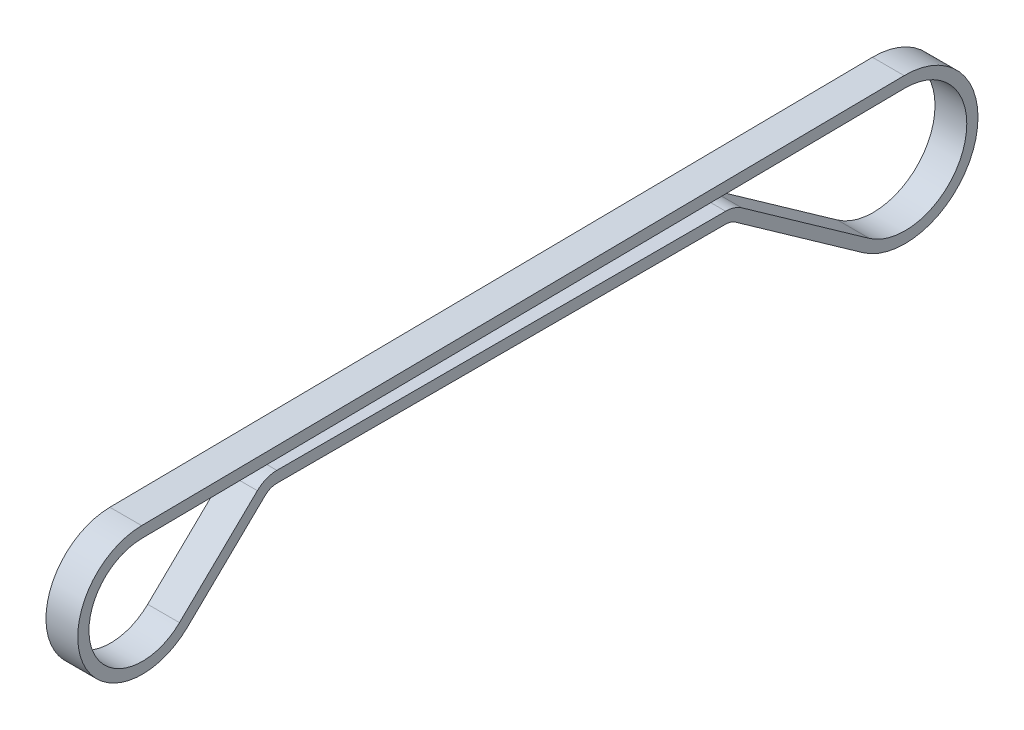
ISO-10303-21;
HEADER;
FILE_DESCRIPTION(('STEP AP214'),'2;1');
FILE_NAME('part.step','',(''),(''),'','','');
FILE_SCHEMA(('AUTOMOTIVE_DESIGN { 1 0 10303 214 1 1 1 1 }'));
ENDSEC;
DATA;
#1=APPLICATION_CONTEXT('core data for automotive mechanical design processes');
#2=APPLICATION_PROTOCOL_DEFINITION('international standard','automotive_design',2000,#1);
#3=PRODUCT_CONTEXT('',#1,'mechanical');
#4=PRODUCT('Part','Part','',(#3));
#5=PRODUCT_RELATED_PRODUCT_CATEGORY('part','',(#4));
#6=PRODUCT_DEFINITION_FORMATION('','',#4);
#7=PRODUCT_DEFINITION_CONTEXT('part definition',#1,'design');
#8=PRODUCT_DEFINITION('design','',#6,#7);
#9=PRODUCT_DEFINITION_SHAPE('','',#8);
#10=(LENGTH_UNIT() NAMED_UNIT(*) SI_UNIT(.MILLI.,.METRE.));
#11=(NAMED_UNIT(*) PLANE_ANGLE_UNIT() SI_UNIT($,.RADIAN.));
#12=(NAMED_UNIT(*) SI_UNIT($,.STERADIAN.) SOLID_ANGLE_UNIT());
#13=UNCERTAINTY_MEASURE_WITH_UNIT(LENGTH_MEASURE(1.E-05),#10,'distance_accuracy_value','');
#14=(GEOMETRIC_REPRESENTATION_CONTEXT(3) GLOBAL_UNCERTAINTY_ASSIGNED_CONTEXT((#13)) GLOBAL_UNIT_ASSIGNED_CONTEXT((#10,
#11,#12)) REPRESENTATION_CONTEXT('',''));
#15=CARTESIAN_POINT('',(0.,0.,0.));
#16=DIRECTION('',(0.,0.,1.));
#17=DIRECTION('',(1.,0.,0.));
#18=AXIS2_PLACEMENT_3D('',#15,#16,#17);
#19=CARTESIAN_POINT('',(15.7818,9.52499999999999,-216.033540427124));
#20=DIRECTION('',(0.,-1.,0.));
#21=DIRECTION('',(0.,0.,-1.));
#22=AXIS2_PLACEMENT_3D('',#19,#20,#21);
#23=PLANE('',#22);
#24=DIRECTION('',(0.,0.,1.));
#25=VECTOR('',#24,1.);
#26=CARTESIAN_POINT('',(6.78180000000002,9.52499999999999,-216.033540427124));
#27=LINE('',#26,#25);
#28=CARTESIAN_POINT('',(6.78180000000002,9.52499999999999,-165.233540427124));
#29=VERTEX_POINT('',#28);
#30=CARTESIAN_POINT('',(6.78180000000002,9.525,-38.1));
#31=VERTEX_POINT('',#30);
#32=EDGE_CURVE('E206',#29,#31,#27,.T.);
#33=ORIENTED_EDGE('',*,*,#32,.F.);
#34=DIRECTION('',(-1.,0.,0.));
#35=VECTOR('',#34,1.);
#36=CARTESIAN_POINT('',(15.7818,9.52499999999999,-165.233540427124));
#37=LINE('',#36,#35);
#38=CARTESIAN_POINT('',(15.7818,9.52499999999999,-165.233540427124));
#39=VERTEX_POINT('',#38);
#40=EDGE_CURVE('E11',#39,#29,#37,.T.);
#41=ORIENTED_EDGE('',*,*,#40,.F.);
#42=DIRECTION('',(0.,0.,1.));
#43=VECTOR('',#42,1.);
#44=CARTESIAN_POINT('',(15.7818,9.52499999999999,-216.033540427124));
#45=LINE('',#44,#43);
#46=CARTESIAN_POINT('',(15.7818,9.525,-38.1));
#47=VERTEX_POINT('',#46);
#48=EDGE_CURVE('E218',#39,#47,#45,.T.);
#49=ORIENTED_EDGE('',*,*,#48,.T.);
#50=DIRECTION('',(-1.,0.,0.));
#51=VECTOR('',#50,1.);
#52=CARTESIAN_POINT('',(15.7818,9.525,-38.1));
#53=LINE('',#52,#51);
#54=EDGE_CURVE('E40',#47,#31,#53,.T.);
#55=ORIENTED_EDGE('',*,*,#54,.T.);
#56=EDGE_LOOP('',(#33,#41,#49,#55));
#57=FACE_BOUND('',#56,.T.);
#58=ADVANCED_FACE('F37',(#57),#23,.T.);
#59=CARTESIAN_POINT('',(15.7818,4.7625,-165.233540427124));
#60=DIRECTION('',(-1.,0.,0.));
#61=DIRECTION('',(0.,0.,1.));
#62=AXIS2_PLACEMENT_3D('',#59,#60,#61);
#63=CYLINDRICAL_SURFACE('',#62,4.76249999999999);
#64=CARTESIAN_POINT('',(6.78180000000002,4.7625,-165.233540427124));
#65=DIRECTION('',(1.,0.,0.));
#66=DIRECTION('',(0.,0.,-1.));
#67=AXIS2_PLACEMENT_3D('',#64,#65,#66);
#68=CIRCLE('',#67,4.76249999999999);
#69=CARTESIAN_POINT('',(6.78180000000002,8.65054709624502,-167.983903317249));
#70=VERTEX_POINT('',#69);
#71=EDGE_CURVE('E222',#70,#29,#68,.T.);
#72=ORIENTED_EDGE('',*,*,#71,.F.);
#73=DIRECTION('',(-1.,0.,0.));
#74=VECTOR('',#73,1.);
#75=CARTESIAN_POINT('',(15.7818,8.65054709624502,-167.983903317249));
#76=LINE('',#75,#74);
#77=CARTESIAN_POINT('',(15.7818,8.65054709624502,-167.983903317249));
#78=VERTEX_POINT('',#77);
#79=EDGE_CURVE('E45',#78,#70,#76,.T.);
#80=ORIENTED_EDGE('',*,*,#79,.F.);
#81=CARTESIAN_POINT('',(15.7818,4.7625,-165.233540427124));
#82=DIRECTION('',(1.,0.,0.));
#83=DIRECTION('',(0.,0.,-1.));
#84=AXIS2_PLACEMENT_3D('',#81,#82,#83);
#85=CIRCLE('',#84,4.76249999999999);
#86=EDGE_CURVE('E238',#78,#39,#85,.T.);
#87=ORIENTED_EDGE('',*,*,#86,.T.);
#88=ORIENTED_EDGE('',*,*,#40,.T.);
#89=EDGE_LOOP('',(#72,#80,#87,#88));
#90=FACE_BOUND('',#89,.T.);
#91=ADVANCED_FACE('F286',(#90),#63,.F.);
#92=CARTESIAN_POINT('',(15.7818,-16.8883353140081,-204.086912833927));
#93=DIRECTION('',(0.,-0.816387841731233,0.577504018924041));
#94=DIRECTION('',(0.,-0.577504018924041,-0.816387841731233));
#95=AXIS2_PLACEMENT_3D('',#92,#93,#94);
#96=PLANE('',#95);
#97=DIRECTION('',(0.,0.577504018924041,0.816387841731233));
#98=VECTOR('',#97,1.);
#99=CARTESIAN_POINT('',(6.78180000000002,-16.8883353140081,-204.086912833927));
#100=LINE('',#99,#98);
#101=CARTESIAN_POINT('',(6.78180000000002,-16.8883353140081,-204.086912833927));
#102=VERTEX_POINT('',#101);
#103=EDGE_CURVE('E258',#102,#70,#100,.T.);
#104=ORIENTED_EDGE('',*,*,#103,.F.);
#105=DIRECTION('',(-1.,0.,0.));
#106=VECTOR('',#105,1.);
#107=CARTESIAN_POINT('',(15.7818,-16.8883353140081,-204.086912833927));
#108=LINE('',#107,#106);
#109=CARTESIAN_POINT('',(15.7818,-16.8883353140081,-204.086912833927));
#110=VERTEX_POINT('',#109);
#111=EDGE_CURVE('E264',#110,#102,#108,.T.);
#112=ORIENTED_EDGE('',*,*,#111,.F.);
#113=DIRECTION('',(0.,0.577504018924041,0.816387841731233));
#114=VECTOR('',#113,1.);
#115=CARTESIAN_POINT('',(15.7818,-16.8883353140081,-204.086912833927));
#116=LINE('',#115,#114);
#117=EDGE_CURVE('E235',#110,#78,#116,.T.);
#118=ORIENTED_EDGE('',*,*,#117,.T.);
#119=ORIENTED_EDGE('',*,*,#79,.T.);
#120=EDGE_LOOP('',(#104,#112,#118,#119));
#121=FACE_BOUND('',#120,.T.);
#122=ADVANCED_FACE('F305',(#121),#96,.T.);
#123=CARTESIAN_POINT('',(15.7818,0.,-216.033540427124));
#124=DIRECTION('',(-1.,0.,0.));
#125=DIRECTION('',(0.,0.,1.));
#126=AXIS2_PLACEMENT_3D('',#123,#124,#125);
#127=CYLINDRICAL_SURFACE('',#126,20.6866570650963);
#128=CARTESIAN_POINT('',(6.78180000000002,0.,-216.033540427124));
#129=DIRECTION('',(1.,0.,0.));
#130=DIRECTION('',(0.,0.,-1.));
#131=AXIS2_PLACEMENT_3D('',#128,#129,#130);
#132=CIRCLE('',#131,20.6866570650963);
#133=CARTESIAN_POINT('',(6.78180000000002,20.6853938432149,-215.804931415962));
#134=VERTEX_POINT('',#133);
#135=EDGE_CURVE('E255',#102,#134,#132,.T.);
#136=ORIENTED_EDGE('',*,*,#135,.T.);
#137=DIRECTION('',(-1.,0.,0.));
#138=VECTOR('',#137,1.);
#139=CARTESIAN_POINT('',(15.7818,20.6853938432149,-215.804931415962));
#140=LINE('',#139,#138);
#141=CARTESIAN_POINT('',(15.7818,20.6853938432149,-215.804931415962));
#142=VERTEX_POINT('',#141);
#143=EDGE_CURVE('E266',#142,#134,#140,.T.);
#144=ORIENTED_EDGE('',*,*,#143,.F.);
#145=CARTESIAN_POINT('',(15.7818,0.,-216.033540427124));
#146=DIRECTION('',(1.,0.,0.));
#147=DIRECTION('',(0.,0.,-1.));
#148=AXIS2_PLACEMENT_3D('',#145,#146,#147);
#149=CIRCLE('',#148,20.6866570650963);
#150=EDGE_CURVE('E233',#110,#142,#149,.T.);
#151=ORIENTED_EDGE('',*,*,#150,.F.);
#152=ORIENTED_EDGE('',*,*,#111,.T.);
#153=EDGE_LOOP('',(#136,#144,#151,#152));
#154=FACE_BOUND('',#153,.T.);
#155=ADVANCED_FACE('F303',(#154),#127,.T.);
#156=CARTESIAN_POINT('',(15.7818,20.6853938432149,-215.804931415962));
#157=DIRECTION('',(0.,0.999938935426957,0.0110510369288809));
#158=DIRECTION('',(0.,-0.0110510369288809,0.999938935426957));
#159=AXIS2_PLACEMENT_3D('',#156,#157,#158);
#160=PLANE('',#159);
#161=DIRECTION('',(0.,0.0110510369288809,-0.999938935426957));
#162=VECTOR('',#161,1.);
#163=CARTESIAN_POINT('',(6.78180000000002,20.6853938432149,-215.804931415962));
#164=LINE('',#163,#162);
#165=CARTESIAN_POINT('',(6.78180000000002,18.2981449953118,0.202225824906893));
#166=VERTEX_POINT('',#165);
#167=EDGE_CURVE('E252',#166,#134,#164,.T.);
#168=ORIENTED_EDGE('',*,*,#167,.F.);
#169=DIRECTION('',(-1.,0.,0.));
#170=VECTOR('',#169,1.);
#171=CARTESIAN_POINT('',(15.7818,18.2981449953118,0.202225824906893));
#172=LINE('',#171,#170);
#173=CARTESIAN_POINT('',(15.7818,18.2981449953118,0.202225824906893));
#174=VERTEX_POINT('',#173);
#175=EDGE_CURVE('E268',#174,#166,#172,.T.);
#176=ORIENTED_EDGE('',*,*,#175,.F.);
#177=DIRECTION('',(0.,0.0110510369288809,-0.999938935426957));
#178=VECTOR('',#177,1.);
#179=CARTESIAN_POINT('',(15.7818,20.6853938432149,-215.804931415962));
#180=LINE('',#179,#178);
#181=EDGE_CURVE('E230',#174,#142,#180,.T.);
#182=ORIENTED_EDGE('',*,*,#181,.T.);
#183=ORIENTED_EDGE('',*,*,#143,.T.);
#184=EDGE_LOOP('',(#168,#176,#182,#183));
#185=FACE_BOUND('',#184,.T.);
#186=ADVANCED_FACE('F299',(#185),#160,.T.);
#187=CARTESIAN_POINT('',(15.7818,0.,0.));
#188=DIRECTION('',(-1.,0.,0.));
#189=DIRECTION('',(0.,0.,1.));
#190=AXIS2_PLACEMENT_3D('',#187,#188,#189);
#191=CYLINDRICAL_SURFACE('',#190,18.2992624319593);
#192=CARTESIAN_POINT('',(6.78180000000002,0.,0.));
#193=DIRECTION('',(1.,0.,0.));
#194=DIRECTION('',(0.,0.,-1.));
#195=AXIS2_PLACEMENT_3D('',#192,#193,#194);
#196=CIRCLE('',#195,18.2992624319593);
#197=CARTESIAN_POINT('',(6.78180000000002,-13.1546357865812,-12.7207925411946));
#198=VERTEX_POINT('',#197);
#199=EDGE_CURVE('E249',#166,#198,#196,.T.);
#200=ORIENTED_EDGE('',*,*,#199,.T.);
#201=DIRECTION('',(-1.,0.,0.));
#202=VECTOR('',#201,1.);
#203=CARTESIAN_POINT('',(15.7818,-13.1546357865812,-12.7207925411946));
#204=LINE('',#203,#202);
#205=CARTESIAN_POINT('',(15.7818,-13.1546357865812,-12.7207925411946));
#206=VERTEX_POINT('',#205);
#207=EDGE_CURVE('E270',#206,#198,#204,.T.);
#208=ORIENTED_EDGE('',*,*,#207,.F.);
#209=CARTESIAN_POINT('',(15.7818,0.,0.));
#210=DIRECTION('',(1.,0.,0.));
#211=DIRECTION('',(0.,0.,-1.));
#212=AXIS2_PLACEMENT_3D('',#209,#210,#211);
#213=CIRCLE('',#212,18.2992624319593);
#214=EDGE_CURVE('E228',#174,#206,#213,.T.);
#215=ORIENTED_EDGE('',*,*,#214,.F.);
#216=ORIENTED_EDGE('',*,*,#175,.T.);
#217=EDGE_LOOP('',(#200,#208,#215,#216));
#218=FACE_BOUND('',#217,.T.);
#219=ADVANCED_FACE('F345',(#218),#191,.T.);
#220=CARTESIAN_POINT('',(15.7818,94.801420308069,-124.358695154729));
#221=DIRECTION('',(0.,-0.718861529829035,-0.695153293117324));
#222=DIRECTION('',(0.,0.695153293117324,-0.718861529829035));
#223=AXIS2_PLACEMENT_3D('',#220,#221,#222);
#224=PLANE('',#223);
#225=DIRECTION('',(0.,-0.695153293117324,0.718861529829035));
#226=VECTOR('',#225,1.);
#227=CARTESIAN_POINT('',(6.78180000000002,94.801420308069,-124.358695154729));
#228=LINE('',#227,#226);
#229=CARTESIAN_POINT('',(6.78180000000002,8.18607803581077,-34.7893324415288));
#230=VERTEX_POINT('',#229);
#231=EDGE_CURVE('E246',#230,#198,#228,.T.);
#232=ORIENTED_EDGE('',*,*,#231,.F.);
#233=DIRECTION('',(-1.,0.,0.));
#234=VECTOR('',#233,1.);
#235=CARTESIAN_POINT('',(15.7818,8.18607803581077,-34.7893324415288));
#236=LINE('',#235,#234);
#237=CARTESIAN_POINT('',(15.7818,8.18607803581077,-34.7893324415288));
#238=VERTEX_POINT('',#237);
#239=EDGE_CURVE('E271',#238,#230,#236,.T.);
#240=ORIENTED_EDGE('',*,*,#239,.F.);
#241=DIRECTION('',(0.,-0.695153293117324,0.718861529829035));
#242=VECTOR('',#241,1.);
#243=CARTESIAN_POINT('',(15.7818,94.801420308069,-124.358695154729));
#244=LINE('',#243,#242);
#245=EDGE_CURVE('E225',#238,#206,#244,.T.);
#246=ORIENTED_EDGE('',*,*,#245,.T.);
#247=ORIENTED_EDGE('',*,*,#207,.T.);
#248=EDGE_LOOP('',(#232,#240,#246,#247));
#249=FACE_BOUND('',#248,.T.);
#250=ADVANCED_FACE('F294',(#249),#224,.T.);
#251=CARTESIAN_POINT('',(15.7818,4.7625,-38.1));
#252=DIRECTION('',(-1.,0.,0.));
#253=DIRECTION('',(0.,0.,1.));
#254=AXIS2_PLACEMENT_3D('',#251,#252,#253);
#255=CYLINDRICAL_SURFACE('',#254,4.76249999999999);
#256=CARTESIAN_POINT('',(6.78180000000002,4.7625,-38.1));
#257=DIRECTION('',(1.,0.,0.));
#258=DIRECTION('',(0.,0.,-1.));
#259=AXIS2_PLACEMENT_3D('',#256,#257,#258);
#260=CIRCLE('',#259,4.76249999999999);
#261=EDGE_CURVE('E243',#31,#230,#260,.T.);
#262=ORIENTED_EDGE('',*,*,#261,.F.);
#263=ORIENTED_EDGE('',*,*,#54,.F.);
#264=CARTESIAN_POINT('',(15.7818,4.7625,-38.1));
#265=DIRECTION('',(1.,0.,0.));
#266=DIRECTION('',(0.,0.,-1.));
#267=AXIS2_PLACEMENT_3D('',#264,#265,#266);
#268=CIRCLE('',#267,4.76249999999999);
#269=EDGE_CURVE('E221',#47,#238,#268,.T.);
#270=ORIENTED_EDGE('',*,*,#269,.T.);
#271=ORIENTED_EDGE('',*,*,#239,.T.);
#272=EDGE_LOOP('',(#262,#263,#270,#271));
#273=FACE_BOUND('',#272,.T.);
#274=ADVANCED_FACE('F279',(#273),#255,.F.);
#275=CARTESIAN_POINT('',(15.7818,4.7625,-38.1));
#276=DIRECTION('',(1.,0.,0.));
#277=DIRECTION('',(0.,0.,-1.));
#278=AXIS2_PLACEMENT_3D('',#275,#276,#277);
#279=PLANE('',#278);
#280=DIRECTION('',(0.,0.,1.));
#281=VECTOR('',#280,1.);
#282=CARTESIAN_POINT('',(15.7818,12.7,-216.033540427124));
#283=LINE('',#282,#281);
#284=CARTESIAN_POINT('',(15.7818,12.7,-165.233540427124));
#285=VERTEX_POINT('',#284);
#286=CARTESIAN_POINT('',(15.7818,12.7,-38.1));
#287=VERTEX_POINT('',#286);
#288=EDGE_CURVE('E153',#285,#287,#283,.T.);
#289=ORIENTED_EDGE('',*,*,#288,.T.);
#290=CARTESIAN_POINT('',(15.7818,4.7625,-38.1));
#291=DIRECTION('',(1.,0.,0.));
#292=DIRECTION('',(0.,0.,-1.));
#293=AXIS2_PLACEMENT_3D('',#290,#291,#292);
#294=CIRCLE('',#293,7.93749999999999);
#295=CARTESIAN_POINT('',(15.7818,10.468463393018,-32.5822207358813));
#296=VERTEX_POINT('',#295);
#297=EDGE_CURVE('E162',#287,#296,#294,.T.);
#298=ORIENTED_EDGE('',*,*,#297,.T.);
#299=DIRECTION('',(0.,-0.695153293117324,0.718861529829035));
#300=VECTOR('',#299,1.);
#301=CARTESIAN_POINT('',(15.7818,97.0838056652762,-122.151583449081));
#302=LINE('',#301,#300);
#303=CARTESIAN_POINT('',(15.7818,-10.872250429374,-10.5136808355471));
#304=VERTEX_POINT('',#303);
#305=EDGE_CURVE('E53',#296,#304,#302,.T.);
#306=ORIENTED_EDGE('',*,*,#305,.T.);
#307=CARTESIAN_POINT('',(15.7818,0.,0.));
#308=DIRECTION('',(1.,0.,0.));
#309=DIRECTION('',(0.,0.,-1.));
#310=AXIS2_PLACEMENT_3D('',#307,#308,#309);
#311=CIRCLE('',#310,15.1242624319593);
#312=CARTESIAN_POINT('',(15.7818,15.1233388753313,0.1671387826577));
#313=VERTEX_POINT('',#312);
#314=EDGE_CURVE('E177',#313,#304,#311,.T.);
#315=ORIENTED_EDGE('',*,*,#314,.F.);
#316=DIRECTION('',(0.,0.0110510369288809,-0.999938935426957));
#317=VECTOR('',#316,1.);
#318=CARTESIAN_POINT('',(15.7818,17.5105877232343,-215.840018458211));
#319=LINE('',#318,#317);
#320=CARTESIAN_POINT('',(15.7818,17.5105877232343,-215.840018458211));
#321=VERTEX_POINT('',#320);
#322=EDGE_CURVE('E179',#313,#321,#319,.T.);
#323=ORIENTED_EDGE('',*,*,#322,.T.);
#324=CARTESIAN_POINT('',(15.7818,0.,-216.033540427124));
#325=DIRECTION('',(1.,0.,0.));
#326=DIRECTION('',(0.,0.,-1.));
#327=AXIS2_PLACEMENT_3D('',#324,#325,#326);
#328=CIRCLE('',#327,17.5116570650963);
#329=CARTESIAN_POINT('',(15.7818,-14.2963039165115,-205.920488094011));
#330=VERTEX_POINT('',#329);
#331=EDGE_CURVE('E182',#330,#321,#328,.T.);
#332=ORIENTED_EDGE('',*,*,#331,.F.);
#333=DIRECTION('',(0.,0.577504018924041,0.816387841731233));
#334=VECTOR('',#333,1.);
#335=CARTESIAN_POINT('',(15.7818,-14.2963039165115,-205.920488094011));
#336=LINE('',#335,#334);
#337=CARTESIAN_POINT('',(15.7818,11.2425784937417,-169.817478577333));
#338=VERTEX_POINT('',#337);
#339=EDGE_CURVE('E184',#330,#338,#336,.T.);
#340=ORIENTED_EDGE('',*,*,#339,.T.);
#341=CARTESIAN_POINT('',(15.7818,4.7625,-165.233540427124));
#342=DIRECTION('',(1.,0.,0.));
#343=DIRECTION('',(0.,0.,-1.));
#344=AXIS2_PLACEMENT_3D('',#341,#342,#343);
#345=CIRCLE('',#344,7.93749999999999);
#346=EDGE_CURVE('E159',#338,#285,#345,.T.);
#347=ORIENTED_EDGE('',*,*,#346,.T.);
#348=EDGE_LOOP('',(#289,#298,#306,#315,#323,#332,#340,#347));
#349=FACE_BOUND('',#348,.T.);
#350=ORIENTED_EDGE('',*,*,#48,.F.);
#351=ORIENTED_EDGE('',*,*,#86,.F.);
#352=ORIENTED_EDGE('',*,*,#117,.F.);
#353=ORIENTED_EDGE('',*,*,#150,.T.);
#354=ORIENTED_EDGE('',*,*,#181,.F.);
#355=ORIENTED_EDGE('',*,*,#214,.T.);
#356=ORIENTED_EDGE('',*,*,#245,.F.);
#357=ORIENTED_EDGE('',*,*,#269,.F.);
#358=EDGE_LOOP('',(#350,#351,#352,#353,#354,#355,#356,#357));
#359=FACE_BOUND('',#358,.T.);
#360=ADVANCED_FACE('F166',(#349,#359),#279,.T.);
#361=CARTESIAN_POINT('',(6.78180000000002,4.7625,-38.1));
#362=DIRECTION('',(1.,0.,0.));
#363=DIRECTION('',(0.,0.,-1.));
#364=AXIS2_PLACEMENT_3D('',#361,#362,#363);
#365=PLANE('',#364);
#366=CARTESIAN_POINT('',(6.78180000000002,4.7625,-38.1));
#367=DIRECTION('',(1.,0.,0.));
#368=DIRECTION('',(0.,0.,-1.));
#369=AXIS2_PLACEMENT_3D('',#366,#367,#368);
#370=CIRCLE('',#369,7.93749999999999);
#371=CARTESIAN_POINT('',(6.78180000000002,12.7,-38.1));
#372=VERTEX_POINT('',#371);
#373=CARTESIAN_POINT('',(6.78180000000002,10.468463393018,-32.5822207358812));
#374=VERTEX_POINT('',#373);
#375=EDGE_CURVE('E188',#372,#374,#370,.T.);
#376=ORIENTED_EDGE('',*,*,#375,.F.);
#377=DIRECTION('',(0.,0.,1.));
#378=VECTOR('',#377,1.);
#379=CARTESIAN_POINT('',(6.78180000000002,12.7,-216.033540427124));
#380=LINE('',#379,#378);
#381=CARTESIAN_POINT('',(6.78180000000002,12.7,-165.233540427124));
#382=VERTEX_POINT('',#381);
#383=EDGE_CURVE('E61',#382,#372,#380,.T.);
#384=ORIENTED_EDGE('',*,*,#383,.F.);
#385=CARTESIAN_POINT('',(6.78180000000002,4.7625,-165.233540427124));
#386=DIRECTION('',(1.,0.,0.));
#387=DIRECTION('',(0.,0.,-1.));
#388=AXIS2_PLACEMENT_3D('',#385,#386,#387);
#389=CIRCLE('',#388,7.93749999999999);
#390=CARTESIAN_POINT('',(6.78180000000002,11.2425784937417,-169.817478577333));
#391=VERTEX_POINT('',#390);
#392=EDGE_CURVE('E170',#391,#382,#389,.T.);
#393=ORIENTED_EDGE('',*,*,#392,.F.);
#394=DIRECTION('',(0.,0.577504018924041,0.816387841731233));
#395=VECTOR('',#394,1.);
#396=CARTESIAN_POINT('',(6.78180000000002,-14.2963039165115,-205.920488094011));
#397=LINE('',#396,#395);
#398=CARTESIAN_POINT('',(6.78180000000002,-14.2963039165115,-205.920488094011));
#399=VERTEX_POINT('',#398);
#400=EDGE_CURVE('E173',#399,#391,#397,.T.);
#401=ORIENTED_EDGE('',*,*,#400,.F.);
#402=CARTESIAN_POINT('',(6.78180000000002,0.,-216.033540427124));
#403=DIRECTION('',(1.,0.,0.));
#404=DIRECTION('',(0.,0.,-1.));
#405=AXIS2_PLACEMENT_3D('',#402,#403,#404);
#406=CIRCLE('',#405,17.5116570650963);
#407=CARTESIAN_POINT('',(6.78180000000002,17.5105877232343,-215.840018458211));
#408=VERTEX_POINT('',#407);
#409=EDGE_CURVE('E199',#399,#408,#406,.T.);
#410=ORIENTED_EDGE('',*,*,#409,.T.);
#411=DIRECTION('',(0.,0.0110510369288809,-0.999938935426957));
#412=VECTOR('',#411,1.);
#413=CARTESIAN_POINT('',(6.78180000000002,17.5105877232343,-215.840018458211));
#414=LINE('',#413,#412);
#415=CARTESIAN_POINT('',(6.78180000000002,15.1233388753313,0.1671387826577));
#416=VERTEX_POINT('',#415);
#417=EDGE_CURVE('E196',#416,#408,#414,.T.);
#418=ORIENTED_EDGE('',*,*,#417,.F.);
#419=CARTESIAN_POINT('',(6.78180000000002,0.,0.));
#420=DIRECTION('',(1.,0.,0.));
#421=DIRECTION('',(0.,0.,-1.));
#422=AXIS2_PLACEMENT_3D('',#419,#420,#421);
#423=CIRCLE('',#422,15.1242624319593);
#424=CARTESIAN_POINT('',(6.78180000000002,-10.872250429374,-10.5136808355471));
#425=VERTEX_POINT('',#424);
#426=EDGE_CURVE('E193',#416,#425,#423,.T.);
#427=ORIENTED_EDGE('',*,*,#426,.T.);
#428=DIRECTION('',(0.,-0.695153293117324,0.718861529829035));
#429=VECTOR('',#428,1.);
#430=CARTESIAN_POINT('',(6.78180000000002,97.0838056652762,-122.151583449081));
#431=LINE('',#430,#429);
#432=EDGE_CURVE('E190',#374,#425,#431,.T.);
#433=ORIENTED_EDGE('',*,*,#432,.F.);
#434=EDGE_LOOP('',(#376,#384,#393,#401,#410,#418,#427,#433));
#435=FACE_BOUND('',#434,.T.);
#436=ORIENTED_EDGE('',*,*,#32,.T.);
#437=ORIENTED_EDGE('',*,*,#261,.T.);
#438=ORIENTED_EDGE('',*,*,#231,.T.);
#439=ORIENTED_EDGE('',*,*,#199,.F.);
#440=ORIENTED_EDGE('',*,*,#167,.T.);
#441=ORIENTED_EDGE('',*,*,#135,.F.);
#442=ORIENTED_EDGE('',*,*,#103,.T.);
#443=ORIENTED_EDGE('',*,*,#71,.T.);
#444=EDGE_LOOP('',(#436,#437,#438,#439,#440,#441,#442,#443));
#445=FACE_BOUND('',#444,.T.);
#446=ADVANCED_FACE('F281',(#435,#445),#365,.F.);
#447=CARTESIAN_POINT('',(15.7818,12.7,-216.033540427124));
#448=DIRECTION('',(0.,-1.,0.));
#449=DIRECTION('',(0.,0.,-1.));
#450=AXIS2_PLACEMENT_3D('',#447,#448,#449);
#451=PLANE('',#450);
#452=ORIENTED_EDGE('',*,*,#383,.T.);
#453=DIRECTION('',(-1.,0.,0.));
#454=VECTOR('',#453,1.);
#455=CARTESIAN_POINT('',(15.7818,12.7,-38.1));
#456=LINE('',#455,#454);
#457=EDGE_CURVE('E149',#287,#372,#456,.T.);
#458=ORIENTED_EDGE('',*,*,#457,.F.);
#459=ORIENTED_EDGE('',*,*,#288,.F.);
#460=DIRECTION('',(-1.,0.,0.));
#461=VECTOR('',#460,1.);
#462=CARTESIAN_POINT('',(15.7818,12.7,-165.233540427124));
#463=LINE('',#462,#461);
#464=EDGE_CURVE('E204',#285,#382,#463,.T.);
#465=ORIENTED_EDGE('',*,*,#464,.T.);
#466=EDGE_LOOP('',(#452,#458,#459,#465));
#467=FACE_BOUND('',#466,.T.);
#468=ADVANCED_FACE('F151',(#467),#451,.F.);
#469=CARTESIAN_POINT('',(15.7818,4.7625,-165.233540427124));
#470=DIRECTION('',(-1.,0.,0.));
#471=DIRECTION('',(0.,0.,1.));
#472=AXIS2_PLACEMENT_3D('',#469,#470,#471);
#473=CYLINDRICAL_SURFACE('',#472,7.93749999999999);
#474=ORIENTED_EDGE('',*,*,#392,.T.);
#475=ORIENTED_EDGE('',*,*,#464,.F.);
#476=ORIENTED_EDGE('',*,*,#346,.F.);
#477=DIRECTION('',(-1.,0.,0.));
#478=VECTOR('',#477,1.);
#479=CARTESIAN_POINT('',(15.7818,11.2425784937417,-169.817478577333));
#480=LINE('',#479,#478);
#481=EDGE_CURVE('E207',#338,#391,#480,.T.);
#482=ORIENTED_EDGE('',*,*,#481,.T.);
#483=EDGE_LOOP('',(#474,#475,#476,#482));
#484=FACE_BOUND('',#483,.T.);
#485=ADVANCED_FACE('F400',(#484),#473,.T.);
#486=CARTESIAN_POINT('',(15.7818,-14.2963039165115,-205.920488094011));
#487=DIRECTION('',(0.,-0.816387841731233,0.577504018924041));
#488=DIRECTION('',(0.,-0.577504018924041,-0.816387841731233));
#489=AXIS2_PLACEMENT_3D('',#486,#487,#488);
#490=PLANE('',#489);
#491=ORIENTED_EDGE('',*,*,#400,.T.);
#492=ORIENTED_EDGE('',*,*,#481,.F.);
#493=ORIENTED_EDGE('',*,*,#339,.F.);
#494=DIRECTION('',(-1.,0.,0.));
#495=VECTOR('',#494,1.);
#496=CARTESIAN_POINT('',(15.7818,-14.2963039165115,-205.920488094011));
#497=LINE('',#496,#495);
#498=EDGE_CURVE('E209',#330,#399,#497,.T.);
#499=ORIENTED_EDGE('',*,*,#498,.T.);
#500=EDGE_LOOP('',(#491,#492,#493,#499));
#501=FACE_BOUND('',#500,.T.);
#502=ADVANCED_FACE('F410',(#501),#490,.F.);
#503=CARTESIAN_POINT('',(15.7818,0.,-216.033540427124));
#504=DIRECTION('',(-1.,0.,0.));
#505=DIRECTION('',(0.,0.,1.));
#506=AXIS2_PLACEMENT_3D('',#503,#504,#505);
#507=CYLINDRICAL_SURFACE('',#506,17.5116570650963);
#508=ORIENTED_EDGE('',*,*,#409,.F.);
#509=ORIENTED_EDGE('',*,*,#498,.F.);
#510=ORIENTED_EDGE('',*,*,#331,.T.);
#511=DIRECTION('',(-1.,0.,0.));
#512=VECTOR('',#511,1.);
#513=CARTESIAN_POINT('',(15.7818,17.5105877232343,-215.840018458211));
#514=LINE('',#513,#512);
#515=EDGE_CURVE('E211',#321,#408,#514,.T.);
#516=ORIENTED_EDGE('',*,*,#515,.T.);
#517=EDGE_LOOP('',(#508,#509,#510,#516));
#518=FACE_BOUND('',#517,.T.);
#519=ADVANCED_FACE('F421',(#518),#507,.F.);
#520=CARTESIAN_POINT('',(15.7818,17.5105877232343,-215.840018458211));
#521=DIRECTION('',(0.,0.999938935426957,0.0110510369288809));
#522=DIRECTION('',(0.,-0.0110510369288809,0.999938935426957));
#523=AXIS2_PLACEMENT_3D('',#520,#521,#522);
#524=PLANE('',#523);
#525=ORIENTED_EDGE('',*,*,#417,.T.);
#526=ORIENTED_EDGE('',*,*,#515,.F.);
#527=ORIENTED_EDGE('',*,*,#322,.F.);
#528=DIRECTION('',(-1.,0.,0.));
#529=VECTOR('',#528,1.);
#530=CARTESIAN_POINT('',(15.7818,15.1233388753313,0.1671387826577));
#531=LINE('',#530,#529);
#532=EDGE_CURVE('E213',#313,#416,#531,.T.);
#533=ORIENTED_EDGE('',*,*,#532,.T.);
#534=EDGE_LOOP('',(#525,#526,#527,#533));
#535=FACE_BOUND('',#534,.T.);
#536=ADVANCED_FACE('F432',(#535),#524,.F.);
#537=CARTESIAN_POINT('',(15.7818,0.,0.));
#538=DIRECTION('',(-1.,0.,0.));
#539=DIRECTION('',(0.,0.,1.));
#540=AXIS2_PLACEMENT_3D('',#537,#538,#539);
#541=CYLINDRICAL_SURFACE('',#540,15.1242624319593);
#542=ORIENTED_EDGE('',*,*,#426,.F.);
#543=ORIENTED_EDGE('',*,*,#532,.F.);
#544=ORIENTED_EDGE('',*,*,#314,.T.);
#545=DIRECTION('',(-1.,0.,0.));
#546=VECTOR('',#545,1.);
#547=CARTESIAN_POINT('',(15.7818,-10.872250429374,-10.5136808355471));
#548=LINE('',#547,#546);
#549=EDGE_CURVE('E215',#304,#425,#548,.T.);
#550=ORIENTED_EDGE('',*,*,#549,.T.);
#551=EDGE_LOOP('',(#542,#543,#544,#550));
#552=FACE_BOUND('',#551,.T.);
#553=ADVANCED_FACE('F443',(#552),#541,.F.);
#554=CARTESIAN_POINT('',(15.7818,97.0838056652762,-122.151583449081));
#555=DIRECTION('',(0.,-0.718861529829035,-0.695153293117324));
#556=DIRECTION('',(0.,0.695153293117324,-0.718861529829035));
#557=AXIS2_PLACEMENT_3D('',#554,#555,#556);
#558=PLANE('',#557);
#559=ORIENTED_EDGE('',*,*,#432,.T.);
#560=ORIENTED_EDGE('',*,*,#549,.F.);
#561=ORIENTED_EDGE('',*,*,#305,.F.);
#562=DIRECTION('',(-1.,0.,0.));
#563=VECTOR('',#562,1.);
#564=CARTESIAN_POINT('',(15.7818,10.468463393018,-32.5822207358812));
#565=LINE('',#564,#563);
#566=EDGE_CURVE('E158',#296,#374,#565,.T.);
#567=ORIENTED_EDGE('',*,*,#566,.T.);
#568=EDGE_LOOP('',(#559,#560,#561,#567));
#569=FACE_BOUND('',#568,.T.);
#570=ADVANCED_FACE('F454',(#569),#558,.F.);
#571=CARTESIAN_POINT('',(15.7818,4.7625,-38.1));
#572=DIRECTION('',(-1.,0.,0.));
#573=DIRECTION('',(0.,0.,1.));
#574=AXIS2_PLACEMENT_3D('',#571,#572,#573);
#575=CYLINDRICAL_SURFACE('',#574,7.93749999999999);
#576=ORIENTED_EDGE('',*,*,#375,.T.);
#577=ORIENTED_EDGE('',*,*,#566,.F.);
#578=ORIENTED_EDGE('',*,*,#297,.F.);
#579=ORIENTED_EDGE('',*,*,#457,.T.);
#580=EDGE_LOOP('',(#576,#577,#578,#579));
#581=FACE_BOUND('',#580,.T.);
#582=ADVANCED_FACE('F163',(#581),#575,.T.);
#583=CLOSED_SHELL('',(#58,#91,#122,#155,#186,#219,#250,#274,#360,#446,#468,#485,#502,#519,#536,
#553,#570,#582));
#584=MANIFOLD_SOLID_BREP('B2',#583);
#585=ADVANCED_BREP_SHAPE_REPRESENTATION('',(#18,#584),#14);
#586=SHAPE_DEFINITION_REPRESENTATION(#9,#585);
ENDSEC;
END-ISO-10303-21;
